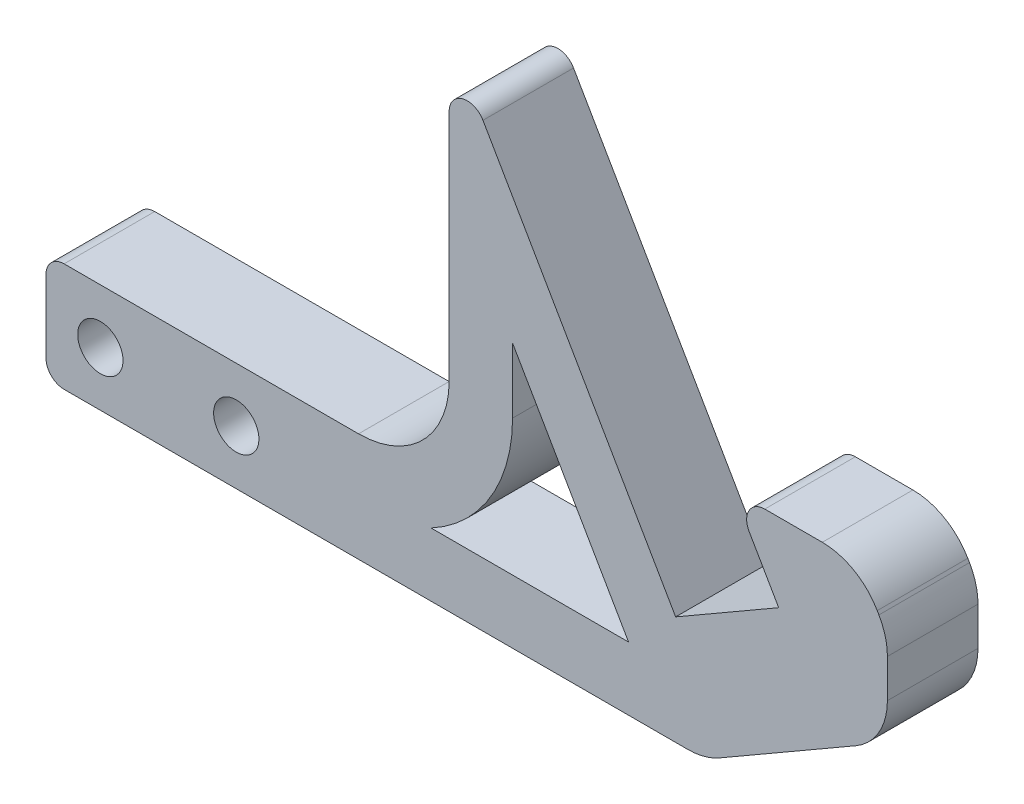
ISO-10303-21;
HEADER;
FILE_DESCRIPTION(('STEP AP214'),'2;1');
FILE_NAME('part.step','',(''),(''),'','','');
FILE_SCHEMA(('AUTOMOTIVE_DESIGN { 1 0 10303 214 1 1 1 1 }'));
ENDSEC;
DATA;
#1=APPLICATION_CONTEXT('core data for automotive mechanical design processes');
#2=APPLICATION_PROTOCOL_DEFINITION('international standard','automotive_design',2000,#1);
#3=PRODUCT_CONTEXT('',#1,'mechanical');
#4=PRODUCT('Part','Part','',(#3));
#5=PRODUCT_RELATED_PRODUCT_CATEGORY('part','',(#4));
#6=PRODUCT_DEFINITION_FORMATION('','',#4);
#7=PRODUCT_DEFINITION_CONTEXT('part definition',#1,'design');
#8=PRODUCT_DEFINITION('design','',#6,#7);
#9=PRODUCT_DEFINITION_SHAPE('','',#8);
#10=(LENGTH_UNIT() NAMED_UNIT(*) SI_UNIT(.MILLI.,.METRE.));
#11=(NAMED_UNIT(*) PLANE_ANGLE_UNIT() SI_UNIT($,.RADIAN.));
#12=(NAMED_UNIT(*) SI_UNIT($,.STERADIAN.) SOLID_ANGLE_UNIT());
#13=UNCERTAINTY_MEASURE_WITH_UNIT(LENGTH_MEASURE(1.E-05),#10,'distance_accuracy_value','');
#14=(GEOMETRIC_REPRESENTATION_CONTEXT(3) GLOBAL_UNCERTAINTY_ASSIGNED_CONTEXT((#13)) GLOBAL_UNIT_ASSIGNED_CONTEXT((#10,
#11,#12)) REPRESENTATION_CONTEXT('',''));
#15=CARTESIAN_POINT('',(0.,0.,0.));
#16=DIRECTION('',(0.,0.,1.));
#17=DIRECTION('',(1.,0.,0.));
#18=AXIS2_PLACEMENT_3D('',#15,#16,#17);
#19=CARTESIAN_POINT('',(32.973417345711,41.8371685740838,10.));
#20=DIRECTION('',(0.,0.,1.));
#21=DIRECTION('',(1.,0.,0.));
#22=AXIS2_PLACEMENT_3D('',#19,#20,#21);
#23=PLANE('',#22);
#24=CARTESIAN_POINT('',(-7.52658265428898,0.,10.));
#25=DIRECTION('',(0.,0.,1.));
#26=DIRECTION('',(1.,0.,0.));
#27=AXIS2_PLACEMENT_3D('',#24,#25,#26);
#28=CIRCLE('',#27,2.5);
#29=CARTESIAN_POINT('',(-5.02658265428898,0.,10.));
#30=VERTEX_POINT('',#29);
#31=EDGE_CURVE('E263',#30,#30,#28,.T.);
#32=ORIENTED_EDGE('',*,*,#31,.F.);
#33=EDGE_LOOP('',(#32));
#34=FACE_BOUND('',#33,.T.);
#35=DIRECTION('',(-0.500000000000004,0.866025403784436,0.));
#36=VECTOR('',#35,1.);
#37=CARTESIAN_POINT('',(55.973417345711,6.,10.));
#38=LINE('',#37,#36);
#39=CARTESIAN_POINT('',(55.973417345711,6.,10.));
#40=VERTEX_POINT('',#39);
#41=CARTESIAN_POINT('',(34.7054681532799,42.8371685740838,10.));
#42=VERTEX_POINT('',#41);
#43=EDGE_CURVE('E271',#40,#42,#38,.T.);
#44=ORIENTED_EDGE('',*,*,#43,.T.);
#45=CARTESIAN_POINT('',(32.973417345711,41.8371685740838,10.));
#46=DIRECTION('',(0.,0.,1.));
#47=DIRECTION('',(1.,0.,0.));
#48=AXIS2_PLACEMENT_3D('',#45,#46,#47);
#49=CIRCLE('',#48,2.);
#50=CARTESIAN_POINT('',(30.973417345711,41.8371685740838,10.));
#51=VERTEX_POINT('',#50);
#52=EDGE_CURVE('E275',#42,#51,#49,.T.);
#53=ORIENTED_EDGE('',*,*,#52,.T.);
#54=DIRECTION('',(0.,-1.,0.));
#55=VECTOR('',#54,1.);
#56=CARTESIAN_POINT('',(30.973417345711,41.8371685740838,10.));
#57=LINE('',#56,#55);
#58=CARTESIAN_POINT('',(30.973417345711,16.0000000000001,10.));
#59=VERTEX_POINT('',#58);
#60=EDGE_CURVE('E279',#51,#59,#57,.T.);
#61=ORIENTED_EDGE('',*,*,#60,.T.);
#62=CARTESIAN_POINT('',(20.973417345711,16.,10.));
#63=DIRECTION('',(0.,0.,-1.));
#64=DIRECTION('',(-1.,0.,0.));
#65=AXIS2_PLACEMENT_3D('',#62,#63,#64);
#66=CIRCLE('',#65,10.);
#67=CARTESIAN_POINT('',(20.9734173457109,6.,10.));
#68=VERTEX_POINT('',#67);
#69=EDGE_CURVE('E282',#59,#68,#66,.T.);
#70=ORIENTED_EDGE('',*,*,#69,.T.);
#71=DIRECTION('',(-1.,0.,0.));
#72=VECTOR('',#71,1.);
#73=CARTESIAN_POINT('',(-11.526582654289,6.,10.));
#74=LINE('',#73,#72);
#75=CARTESIAN_POINT('',(-11.526582654289,6.,10.));
#76=VERTEX_POINT('',#75);
#77=EDGE_CURVE('E285',#68,#76,#74,.T.);
#78=ORIENTED_EDGE('',*,*,#77,.T.);
#79=CARTESIAN_POINT('',(-11.526582654289,4.,10.));
#80=DIRECTION('',(0.,0.,1.));
#81=DIRECTION('',(1.,0.,0.));
#82=AXIS2_PLACEMENT_3D('',#79,#80,#81);
#83=CIRCLE('',#82,2.);
#84=CARTESIAN_POINT('',(-13.526582654289,3.99999999999999,10.));
#85=VERTEX_POINT('',#84);
#86=EDGE_CURVE('E288',#76,#85,#83,.T.);
#87=ORIENTED_EDGE('',*,*,#86,.T.);
#88=DIRECTION('',(0.,-1.,0.));
#89=VECTOR('',#88,1.);
#90=CARTESIAN_POINT('',(-13.526582654289,-3.99999999999999,10.));
#91=LINE('',#90,#89);
#92=CARTESIAN_POINT('',(-13.526582654289,-4.,10.));
#93=VERTEX_POINT('',#92);
#94=EDGE_CURVE('E291',#85,#93,#91,.T.);
#95=ORIENTED_EDGE('',*,*,#94,.T.);
#96=CARTESIAN_POINT('',(-11.526582654289,-4.,10.));
#97=DIRECTION('',(0.,0.,1.));
#98=DIRECTION('',(-1.,0.,0.));
#99=AXIS2_PLACEMENT_3D('',#96,#97,#98);
#100=CIRCLE('',#99,2.);
#101=CARTESIAN_POINT('',(-11.526582654289,-6.,10.));
#102=VERTEX_POINT('',#101);
#103=EDGE_CURVE('E294',#93,#102,#100,.T.);
#104=ORIENTED_EDGE('',*,*,#103,.T.);
#105=DIRECTION('',(1.,0.,0.));
#106=VECTOR('',#105,1.);
#107=CARTESIAN_POINT('',(57.3131633078666,-6.,10.));
#108=LINE('',#107,#106);
#109=CARTESIAN_POINT('',(57.3131633078666,-6.,10.));
#110=VERTEX_POINT('',#109);
#111=EDGE_CURVE('E297',#102,#110,#108,.T.);
#112=ORIENTED_EDGE('',*,*,#111,.T.);
#113=CARTESIAN_POINT('',(57.3131633078667,0.999999999999997,10.));
#114=DIRECTION('',(0.,0.,1.));
#115=DIRECTION('',(-1.,0.,0.));
#116=AXIS2_PLACEMENT_3D('',#113,#114,#115);
#117=CIRCLE('',#116,7.);
#118=CARTESIAN_POINT('',(60.8131633078667,-5.06217782649104,10.));
#119=VERTEX_POINT('',#118);
#120=EDGE_CURVE('E300',#110,#119,#117,.T.);
#121=ORIENTED_EDGE('',*,*,#120,.T.);
#122=DIRECTION('',(0.866025403784434,0.500000000000007,0.));
#123=VECTOR('',#122,1.);
#124=CARTESIAN_POINT('',(75.848943547597,3.61873394239349,10.));
#125=LINE('',#124,#123);
#126=CARTESIAN_POINT('',(75.848943547597,3.61873394239348,10.));
#127=VERTEX_POINT('',#126);
#128=EDGE_CURVE('E303',#119,#127,#125,.T.);
#129=ORIENTED_EDGE('',*,*,#128,.T.);
#130=CARTESIAN_POINT('',(72.3489435475969,9.68091176888453,10.));
#131=DIRECTION('',(0.,0.,1.));
#132=DIRECTION('',(-1.,0.,0.));
#133=AXIS2_PLACEMENT_3D('',#130,#131,#132);
#134=CIRCLE('',#133,7.00000000000002);
#135=CARTESIAN_POINT('',(79.348943547597,9.68091176888453,10.));
#136=VERTEX_POINT('',#135);
#137=EDGE_CURVE('E306',#127,#136,#134,.T.);
#138=ORIENTED_EDGE('',*,*,#137,.T.);
#139=DIRECTION('',(0.,1.,0.));
#140=VECTOR('',#139,1.);
#141=CARTESIAN_POINT('',(79.348943547597,13.9074090769882,10.));
#142=LINE('',#141,#140);
#143=CARTESIAN_POINT('',(79.348943547597,13.9074090769882,10.));
#144=VERTEX_POINT('',#143);
#145=EDGE_CURVE('E309',#136,#144,#142,.T.);
#146=ORIENTED_EDGE('',*,*,#145,.T.);
#147=CARTESIAN_POINT('',(72.3489435475969,13.9074090769882,10.));
#148=DIRECTION('',(0.,0.,1.));
#149=DIRECTION('',(1.,0.,0.));
#150=AXIS2_PLACEMENT_3D('',#147,#148,#149);
#151=CIRCLE('',#150,7.00000000000001);
#152=CARTESIAN_POINT('',(78.411121374088,17.4074090769882,10.));
#153=VERTEX_POINT('',#152);
#154=EDGE_CURVE('E312',#144,#153,#151,.T.);
#155=ORIENTED_EDGE('',*,*,#154,.T.);
#156=DIRECTION('',(-0.499999999999973,0.866025403784454,0.));
#157=VECTOR('',#156,1.);
#158=CARTESIAN_POINT('',(78.2260759503117,17.727917152677,10.));
#159=LINE('',#158,#157);
#160=CARTESIAN_POINT('',(78.2260759503117,17.727917152677,10.));
#161=VERTEX_POINT('',#160);
#162=EDGE_CURVE('E315',#153,#161,#159,.T.);
#163=ORIENTED_EDGE('',*,*,#162,.T.);
#164=CARTESIAN_POINT('',(72.1638981238206,14.227917152677,10.));
#165=DIRECTION('',(0.,0.,1.));
#166=DIRECTION('',(-1.,0.,0.));
#167=AXIS2_PLACEMENT_3D('',#164,#165,#166);
#168=CIRCLE('',#167,7.);
#169=CARTESIAN_POINT('',(72.1638981238206,21.227917152677,10.));
#170=VERTEX_POINT('',#169);
#171=EDGE_CURVE('E318',#161,#170,#168,.T.);
#172=ORIENTED_EDGE('',*,*,#171,.T.);
#173=DIRECTION('',(-1.,0.,0.));
#174=VECTOR('',#173,1.);
#175=CARTESIAN_POINT('',(65.8130451627347,21.227917152677,10.));
#176=LINE('',#175,#174);
#177=CARTESIAN_POINT('',(65.8130451627347,21.227917152677,10.));
#178=VERTEX_POINT('',#177);
#179=EDGE_CURVE('E321',#170,#178,#176,.T.);
#180=ORIENTED_EDGE('',*,*,#179,.T.);
#181=CARTESIAN_POINT('',(65.8130451627347,19.227917152677,10.));
#182=DIRECTION('',(0.,0.,1.));
#183=DIRECTION('',(-1.,0.,0.));
#184=AXIS2_PLACEMENT_3D('',#181,#182,#183);
#185=CIRCLE('',#184,2.);
#186=CARTESIAN_POINT('',(64.0809943551658,18.227917152677,10.));
#187=VERTEX_POINT('',#186);
#188=EDGE_CURVE('E324',#178,#187,#185,.T.);
#189=ORIENTED_EDGE('',*,*,#188,.T.);
#190=DIRECTION('',(0.500000000000004,-0.866025403784436,0.));
#191=VECTOR('',#190,1.);
#192=CARTESIAN_POINT('',(67.348943547597,12.5676631148326,10.));
#193=LINE('',#192,#191);
#194=CARTESIAN_POINT('',(67.348943547597,12.5676631148326,10.));
#195=VERTEX_POINT('',#194);
#196=EDGE_CURVE('E327',#187,#195,#193,.T.);
#197=ORIENTED_EDGE('',*,*,#196,.T.);
#198=DIRECTION('',(-0.866025403784434,-0.500000000000008,0.));
#199=VECTOR('',#198,1.);
#200=CARTESIAN_POINT('',(67.348943547597,12.5676631148326,10.));
#201=LINE('',#200,#199);
#202=EDGE_CURVE('E330',#195,#40,#201,.T.);
#203=ORIENTED_EDGE('',*,*,#202,.T.);
#204=EDGE_LOOP('',(#44,#53,#61,#70,#78,#87,#95,#104,#112,#121,#129,#138,#146,#155,#163,#172,
#180,#189,#197,#203));
#205=FACE_BOUND('',#204,.T.);
#206=CARTESIAN_POINT('',(7.47341734571102,0.,10.));
#207=DIRECTION('',(0.,0.,1.));
#208=DIRECTION('',(1.,0.,0.));
#209=AXIS2_PLACEMENT_3D('',#206,#207,#208);
#210=CIRCLE('',#209,2.5);
#211=CARTESIAN_POINT('',(9.97341734571102,0.,10.));
#212=VERTEX_POINT('',#211);
#213=EDGE_CURVE('E255',#212,#212,#210,.T.);
#214=ORIENTED_EDGE('',*,*,#213,.F.);
#215=EDGE_LOOP('',(#214));
#216=FACE_BOUND('',#215,.T.);
#217=DIRECTION('',(0.,-1.,0.));
#218=VECTOR('',#217,1.);
#219=CARTESIAN_POINT('',(37.973417345711,23.1769145362398,10.));
#220=LINE('',#219,#218);
#221=CARTESIAN_POINT('',(37.973417345711,23.1769145362398,10.));
#222=VERTEX_POINT('',#221);
#223=CARTESIAN_POINT('',(37.973417345711,16.0000000000001,10.));
#224=VERTEX_POINT('',#223);
#225=EDGE_CURVE('E216',#222,#224,#220,.T.);
#226=ORIENTED_EDGE('',*,*,#225,.F.);
#227=DIRECTION('',(-0.5,0.866025403784439,0.));
#228=VECTOR('',#227,1.);
#229=CARTESIAN_POINT('',(50.7772649230044,1.,10.));
#230=LINE('',#229,#228);
#231=CARTESIAN_POINT('',(50.7772649230044,1.,10.));
#232=VERTEX_POINT('',#231);
#233=EDGE_CURVE('E207',#232,#222,#230,.T.);
#234=ORIENTED_EDGE('',*,*,#233,.F.);
#235=DIRECTION('',(1.,0.,0.));
#236=VECTOR('',#235,1.);
#237=CARTESIAN_POINT('',(50.7772649230044,1.,10.));
#238=LINE('',#237,#236);
#239=CARTESIAN_POINT('',(28.973417345711,1.,10.));
#240=VERTEX_POINT('',#239);
#241=EDGE_CURVE('E233',#240,#232,#238,.T.);
#242=ORIENTED_EDGE('',*,*,#241,.F.);
#243=CARTESIAN_POINT('',(20.973417345711,16.,10.));
#244=DIRECTION('',(0.,0.,-1.));
#245=DIRECTION('',(-1.,0.,0.));
#246=AXIS2_PLACEMENT_3D('',#243,#244,#245);
#247=CIRCLE('',#246,17.);
#248=EDGE_CURVE('E229',#224,#240,#247,.T.);
#249=ORIENTED_EDGE('',*,*,#248,.F.);
#250=EDGE_LOOP('',(#226,#234,#242,#249));
#251=FACE_BOUND('',#250,.T.);
#252=ADVANCED_FACE('F45',(#34,#205,#216,#251),#23,.T.);
#253=CARTESIAN_POINT('',(32.973417345711,41.8371685740838,0.));
#254=DIRECTION('',(0.,0.,1.));
#255=DIRECTION('',(1.,0.,0.));
#256=AXIS2_PLACEMENT_3D('',#253,#254,#255);
#257=PLANE('',#256);
#258=CARTESIAN_POINT('',(7.47341734571102,0.,0.));
#259=DIRECTION('',(0.,0.,1.));
#260=DIRECTION('',(1.,0.,0.));
#261=AXIS2_PLACEMENT_3D('',#258,#259,#260);
#262=CIRCLE('',#261,2.5);
#263=CARTESIAN_POINT('',(9.97341734571102,0.,0.));
#264=VERTEX_POINT('',#263);
#265=EDGE_CURVE('E225',#264,#264,#262,.T.);
#266=ORIENTED_EDGE('',*,*,#265,.T.);
#267=EDGE_LOOP('',(#266));
#268=FACE_BOUND('',#267,.T.);
#269=CARTESIAN_POINT('',(-7.52658265428898,0.,0.));
#270=DIRECTION('',(0.,0.,1.));
#271=DIRECTION('',(1.,0.,0.));
#272=AXIS2_PLACEMENT_3D('',#269,#270,#271);
#273=CIRCLE('',#272,2.5);
#274=CARTESIAN_POINT('',(-5.02658265428898,0.,0.));
#275=VERTEX_POINT('',#274);
#276=EDGE_CURVE('E259',#275,#275,#273,.T.);
#277=ORIENTED_EDGE('',*,*,#276,.T.);
#278=EDGE_LOOP('',(#277));
#279=FACE_BOUND('',#278,.T.);
#280=DIRECTION('',(-0.500000000000004,0.866025403784436,0.));
#281=VECTOR('',#280,1.);
#282=CARTESIAN_POINT('',(55.973417345711,6.,0.));
#283=LINE('',#282,#281);
#284=CARTESIAN_POINT('',(55.973417345711,6.,0.));
#285=VERTEX_POINT('',#284);
#286=CARTESIAN_POINT('',(34.7054681532799,42.8371685740838,0.));
#287=VERTEX_POINT('',#286);
#288=EDGE_CURVE('E267',#285,#287,#283,.T.);
#289=ORIENTED_EDGE('',*,*,#288,.F.);
#290=DIRECTION('',(-0.866025403784434,-0.500000000000008,0.));
#291=VECTOR('',#290,1.);
#292=CARTESIAN_POINT('',(67.348943547597,12.5676631148326,0.));
#293=LINE('',#292,#291);
#294=CARTESIAN_POINT('',(67.348943547597,12.5676631148326,0.));
#295=VERTEX_POINT('',#294);
#296=EDGE_CURVE('E276',#295,#285,#293,.T.);
#297=ORIENTED_EDGE('',*,*,#296,.F.);
#298=DIRECTION('',(0.500000000000004,-0.866025403784436,0.));
#299=VECTOR('',#298,1.);
#300=CARTESIAN_POINT('',(67.348943547597,12.5676631148326,0.));
#301=LINE('',#300,#299);
#302=CARTESIAN_POINT('',(64.0809943551658,18.227917152677,0.));
#303=VERTEX_POINT('',#302);
#304=EDGE_CURVE('E388',#303,#295,#301,.T.);
#305=ORIENTED_EDGE('',*,*,#304,.F.);
#306=CARTESIAN_POINT('',(65.8130451627347,19.227917152677,0.));
#307=DIRECTION('',(0.,0.,1.));
#308=DIRECTION('',(-1.,0.,0.));
#309=AXIS2_PLACEMENT_3D('',#306,#307,#308);
#310=CIRCLE('',#309,2.);
#311=CARTESIAN_POINT('',(65.8130451627347,21.227917152677,0.));
#312=VERTEX_POINT('',#311);
#313=EDGE_CURVE('E385',#312,#303,#310,.T.);
#314=ORIENTED_EDGE('',*,*,#313,.F.);
#315=DIRECTION('',(-1.,0.,0.));
#316=VECTOR('',#315,1.);
#317=CARTESIAN_POINT('',(65.8130451627347,21.227917152677,0.));
#318=LINE('',#317,#316);
#319=CARTESIAN_POINT('',(72.1638981238206,21.227917152677,0.));
#320=VERTEX_POINT('',#319);
#321=EDGE_CURVE('E382',#320,#312,#318,.T.);
#322=ORIENTED_EDGE('',*,*,#321,.F.);
#323=CARTESIAN_POINT('',(72.1638981238206,14.227917152677,0.));
#324=DIRECTION('',(0.,0.,1.));
#325=DIRECTION('',(-1.,0.,0.));
#326=AXIS2_PLACEMENT_3D('',#323,#324,#325);
#327=CIRCLE('',#326,7.);
#328=CARTESIAN_POINT('',(78.2260759503117,17.727917152677,0.));
#329=VERTEX_POINT('',#328);
#330=EDGE_CURVE('E379',#329,#320,#327,.T.);
#331=ORIENTED_EDGE('',*,*,#330,.F.);
#332=DIRECTION('',(-0.499999999999973,0.866025403784454,0.));
#333=VECTOR('',#332,1.);
#334=CARTESIAN_POINT('',(78.2260759503117,17.727917152677,0.));
#335=LINE('',#334,#333);
#336=CARTESIAN_POINT('',(78.411121374088,17.4074090769882,0.));
#337=VERTEX_POINT('',#336);
#338=EDGE_CURVE('E376',#337,#329,#335,.T.);
#339=ORIENTED_EDGE('',*,*,#338,.F.);
#340=CARTESIAN_POINT('',(72.3489435475969,13.9074090769882,0.));
#341=DIRECTION('',(0.,0.,1.));
#342=DIRECTION('',(1.,0.,0.));
#343=AXIS2_PLACEMENT_3D('',#340,#341,#342);
#344=CIRCLE('',#343,7.00000000000001);
#345=CARTESIAN_POINT('',(79.348943547597,13.9074090769882,0.));
#346=VERTEX_POINT('',#345);
#347=EDGE_CURVE('E373',#346,#337,#344,.T.);
#348=ORIENTED_EDGE('',*,*,#347,.F.);
#349=DIRECTION('',(0.,1.,0.));
#350=VECTOR('',#349,1.);
#351=CARTESIAN_POINT('',(79.348943547597,13.9074090769882,0.));
#352=LINE('',#351,#350);
#353=CARTESIAN_POINT('',(79.348943547597,9.68091176888453,0.));
#354=VERTEX_POINT('',#353);
#355=EDGE_CURVE('E370',#354,#346,#352,.T.);
#356=ORIENTED_EDGE('',*,*,#355,.F.);
#357=CARTESIAN_POINT('',(72.3489435475969,9.68091176888453,0.));
#358=DIRECTION('',(0.,0.,1.));
#359=DIRECTION('',(-1.,0.,0.));
#360=AXIS2_PLACEMENT_3D('',#357,#358,#359);
#361=CIRCLE('',#360,7.00000000000002);
#362=CARTESIAN_POINT('',(75.848943547597,3.61873394239348,0.));
#363=VERTEX_POINT('',#362);
#364=EDGE_CURVE('E367',#363,#354,#361,.T.);
#365=ORIENTED_EDGE('',*,*,#364,.F.);
#366=DIRECTION('',(0.866025403784434,0.500000000000007,0.));
#367=VECTOR('',#366,1.);
#368=CARTESIAN_POINT('',(75.848943547597,3.61873394239349,0.));
#369=LINE('',#368,#367);
#370=CARTESIAN_POINT('',(60.8131633078667,-5.06217782649104,0.));
#371=VERTEX_POINT('',#370);
#372=EDGE_CURVE('E364',#371,#363,#369,.T.);
#373=ORIENTED_EDGE('',*,*,#372,.F.);
#374=CARTESIAN_POINT('',(57.3131633078667,0.999999999999997,0.));
#375=DIRECTION('',(0.,0.,1.));
#376=DIRECTION('',(-1.,0.,0.));
#377=AXIS2_PLACEMENT_3D('',#374,#375,#376);
#378=CIRCLE('',#377,7.);
#379=CARTESIAN_POINT('',(57.3131633078666,-6.,0.));
#380=VERTEX_POINT('',#379);
#381=EDGE_CURVE('E361',#380,#371,#378,.T.);
#382=ORIENTED_EDGE('',*,*,#381,.F.);
#383=DIRECTION('',(1.,0.,0.));
#384=VECTOR('',#383,1.);
#385=CARTESIAN_POINT('',(57.3131633078666,-6.,0.));
#386=LINE('',#385,#384);
#387=CARTESIAN_POINT('',(-11.526582654289,-6.,0.));
#388=VERTEX_POINT('',#387);
#389=EDGE_CURVE('E358',#388,#380,#386,.T.);
#390=ORIENTED_EDGE('',*,*,#389,.F.);
#391=CARTESIAN_POINT('',(-11.526582654289,-4.,0.));
#392=DIRECTION('',(0.,0.,1.));
#393=DIRECTION('',(-1.,0.,0.));
#394=AXIS2_PLACEMENT_3D('',#391,#392,#393);
#395=CIRCLE('',#394,2.);
#396=CARTESIAN_POINT('',(-13.526582654289,-4.,0.));
#397=VERTEX_POINT('',#396);
#398=EDGE_CURVE('E355',#397,#388,#395,.T.);
#399=ORIENTED_EDGE('',*,*,#398,.F.);
#400=DIRECTION('',(0.,-1.,0.));
#401=VECTOR('',#400,1.);
#402=CARTESIAN_POINT('',(-13.526582654289,-3.99999999999999,0.));
#403=LINE('',#402,#401);
#404=CARTESIAN_POINT('',(-13.526582654289,3.99999999999999,0.));
#405=VERTEX_POINT('',#404);
#406=EDGE_CURVE('E352',#405,#397,#403,.T.);
#407=ORIENTED_EDGE('',*,*,#406,.F.);
#408=CARTESIAN_POINT('',(-11.526582654289,4.,0.));
#409=DIRECTION('',(0.,0.,1.));
#410=DIRECTION('',(1.,0.,0.));
#411=AXIS2_PLACEMENT_3D('',#408,#409,#410);
#412=CIRCLE('',#411,2.);
#413=CARTESIAN_POINT('',(-11.526582654289,6.,0.));
#414=VERTEX_POINT('',#413);
#415=EDGE_CURVE('E349',#414,#405,#412,.T.);
#416=ORIENTED_EDGE('',*,*,#415,.F.);
#417=DIRECTION('',(-1.,0.,0.));
#418=VECTOR('',#417,1.);
#419=CARTESIAN_POINT('',(-11.526582654289,6.,0.));
#420=LINE('',#419,#418);
#421=CARTESIAN_POINT('',(20.9734173457109,6.,0.));
#422=VERTEX_POINT('',#421);
#423=EDGE_CURVE('E346',#422,#414,#420,.T.);
#424=ORIENTED_EDGE('',*,*,#423,.F.);
#425=CARTESIAN_POINT('',(20.973417345711,16.,0.));
#426=DIRECTION('',(0.,0.,-1.));
#427=DIRECTION('',(-1.,0.,0.));
#428=AXIS2_PLACEMENT_3D('',#425,#426,#427);
#429=CIRCLE('',#428,10.);
#430=CARTESIAN_POINT('',(30.973417345711,16.0000000000001,0.));
#431=VERTEX_POINT('',#430);
#432=EDGE_CURVE('E343',#431,#422,#429,.T.);
#433=ORIENTED_EDGE('',*,*,#432,.F.);
#434=DIRECTION('',(0.,-1.,0.));
#435=VECTOR('',#434,1.);
#436=CARTESIAN_POINT('',(30.973417345711,41.8371685740838,0.));
#437=LINE('',#436,#435);
#438=CARTESIAN_POINT('',(30.973417345711,41.8371685740838,0.));
#439=VERTEX_POINT('',#438);
#440=EDGE_CURVE('E340',#439,#431,#437,.T.);
#441=ORIENTED_EDGE('',*,*,#440,.F.);
#442=CARTESIAN_POINT('',(32.973417345711,41.8371685740838,0.));
#443=DIRECTION('',(0.,0.,1.));
#444=DIRECTION('',(1.,0.,0.));
#445=AXIS2_PLACEMENT_3D('',#442,#443,#444);
#446=CIRCLE('',#445,2.);
#447=EDGE_CURVE('E337',#287,#439,#446,.T.);
#448=ORIENTED_EDGE('',*,*,#447,.F.);
#449=EDGE_LOOP('',(#289,#297,#305,#314,#322,#331,#339,#348,#356,#365,#373,#382,#390,#399,#407,
#416,#424,#433,#441,#448));
#450=FACE_BOUND('',#449,.T.);
#451=DIRECTION('',(-0.5,0.866025403784439,0.));
#452=VECTOR('',#451,1.);
#453=CARTESIAN_POINT('',(50.7772649230044,1.,0.));
#454=LINE('',#453,#452);
#455=CARTESIAN_POINT('',(50.7772649230044,1.,0.));
#456=VERTEX_POINT('',#455);
#457=CARTESIAN_POINT('',(37.973417345711,23.1769145362398,0.));
#458=VERTEX_POINT('',#457);
#459=EDGE_CURVE('E69',#456,#458,#454,.T.);
#460=ORIENTED_EDGE('',*,*,#459,.T.);
#461=DIRECTION('',(0.,-1.,0.));
#462=VECTOR('',#461,1.);
#463=CARTESIAN_POINT('',(37.973417345711,23.1769145362398,0.));
#464=LINE('',#463,#462);
#465=CARTESIAN_POINT('',(37.973417345711,16.0000000000001,0.));
#466=VERTEX_POINT('',#465);
#467=EDGE_CURVE('E223',#458,#466,#464,.T.);
#468=ORIENTED_EDGE('',*,*,#467,.T.);
#469=CARTESIAN_POINT('',(20.973417345711,16.,0.));
#470=DIRECTION('',(0.,0.,-1.));
#471=DIRECTION('',(-1.,0.,0.));
#472=AXIS2_PLACEMENT_3D('',#469,#470,#471);
#473=CIRCLE('',#472,17.);
#474=CARTESIAN_POINT('',(28.973417345711,1.,0.));
#475=VERTEX_POINT('',#474);
#476=EDGE_CURVE('E242',#466,#475,#473,.T.);
#477=ORIENTED_EDGE('',*,*,#476,.T.);
#478=DIRECTION('',(1.,0.,0.));
#479=VECTOR('',#478,1.);
#480=CARTESIAN_POINT('',(50.7772649230044,1.,0.));
#481=LINE('',#480,#479);
#482=EDGE_CURVE('E217',#475,#456,#481,.T.);
#483=ORIENTED_EDGE('',*,*,#482,.T.);
#484=EDGE_LOOP('',(#460,#468,#477,#483));
#485=FACE_BOUND('',#484,.T.);
#486=ADVANCED_FACE('F475',(#268,#279,#450,#485),#257,.F.);
#487=CARTESIAN_POINT('',(55.973417345711,6.,10.));
#488=DIRECTION('',(-0.866025403784436,-0.500000000000004,0.));
#489=DIRECTION('',(0.500000000000004,-0.866025403784436,0.));
#490=AXIS2_PLACEMENT_3D('',#487,#488,#489);
#491=PLANE('',#490);
#492=ORIENTED_EDGE('',*,*,#288,.T.);
#493=DIRECTION('',(0.,0.,-1.));
#494=VECTOR('',#493,1.);
#495=CARTESIAN_POINT('',(34.7054681532799,42.8371685740838,10.));
#496=LINE('',#495,#494);
#497=EDGE_CURVE('E11',#42,#287,#496,.T.);
#498=ORIENTED_EDGE('',*,*,#497,.F.);
#499=ORIENTED_EDGE('',*,*,#43,.F.);
#500=DIRECTION('',(0.,0.,-1.));
#501=VECTOR('',#500,1.);
#502=CARTESIAN_POINT('',(55.973417345711,6.,10.));
#503=LINE('',#502,#501);
#504=EDGE_CURVE('E333',#40,#285,#503,.T.);
#505=ORIENTED_EDGE('',*,*,#504,.T.);
#506=EDGE_LOOP('',(#492,#498,#499,#505));
#507=FACE_BOUND('',#506,.T.);
#508=ADVANCED_FACE('F47',(#507),#491,.F.);
#509=CARTESIAN_POINT('',(32.973417345711,41.8371685740838,10.));
#510=DIRECTION('',(0.,0.,-1.));
#511=DIRECTION('',(-1.,0.,0.));
#512=AXIS2_PLACEMENT_3D('',#509,#510,#511);
#513=CYLINDRICAL_SURFACE('',#512,2.);
#514=ORIENTED_EDGE('',*,*,#447,.T.);
#515=DIRECTION('',(0.,0.,-1.));
#516=VECTOR('',#515,1.);
#517=CARTESIAN_POINT('',(30.973417345711,41.8371685740838,10.));
#518=LINE('',#517,#516);
#519=EDGE_CURVE('E54',#51,#439,#518,.T.);
#520=ORIENTED_EDGE('',*,*,#519,.F.);
#521=ORIENTED_EDGE('',*,*,#52,.F.);
#522=ORIENTED_EDGE('',*,*,#497,.T.);
#523=EDGE_LOOP('',(#514,#520,#521,#522));
#524=FACE_BOUND('',#523,.T.);
#525=ADVANCED_FACE('F493',(#524),#513,.T.);
#526=CARTESIAN_POINT('',(30.973417345711,41.8371685740838,10.));
#527=DIRECTION('',(1.,0.,0.));
#528=DIRECTION('',(0.,1.,0.));
#529=AXIS2_PLACEMENT_3D('',#526,#527,#528);
#530=PLANE('',#529);
#531=ORIENTED_EDGE('',*,*,#440,.T.);
#532=DIRECTION('',(0.,0.,-1.));
#533=VECTOR('',#532,1.);
#534=CARTESIAN_POINT('',(30.973417345711,16.0000000000001,10.));
#535=LINE('',#534,#533);
#536=EDGE_CURVE('E460',#59,#431,#535,.T.);
#537=ORIENTED_EDGE('',*,*,#536,.F.);
#538=ORIENTED_EDGE('',*,*,#60,.F.);
#539=ORIENTED_EDGE('',*,*,#519,.T.);
#540=EDGE_LOOP('',(#531,#537,#538,#539));
#541=FACE_BOUND('',#540,.T.);
#542=ADVANCED_FACE('F469',(#541),#530,.F.);
#543=CARTESIAN_POINT('',(20.973417345711,16.,10.));
#544=DIRECTION('',(0.,0.,-1.));
#545=DIRECTION('',(-1.,0.,0.));
#546=AXIS2_PLACEMENT_3D('',#543,#544,#545);
#547=CYLINDRICAL_SURFACE('',#546,10.);
#548=ORIENTED_EDGE('',*,*,#432,.T.);
#549=DIRECTION('',(0.,0.,-1.));
#550=VECTOR('',#549,1.);
#551=CARTESIAN_POINT('',(20.9734173457109,6.,10.));
#552=LINE('',#551,#550);
#553=EDGE_CURVE('E456',#68,#422,#552,.T.);
#554=ORIENTED_EDGE('',*,*,#553,.F.);
#555=ORIENTED_EDGE('',*,*,#69,.F.);
#556=ORIENTED_EDGE('',*,*,#536,.T.);
#557=EDGE_LOOP('',(#548,#554,#555,#556));
#558=FACE_BOUND('',#557,.T.);
#559=ADVANCED_FACE('F481',(#558),#547,.F.);
#560=CARTESIAN_POINT('',(-11.526582654289,6.,10.));
#561=DIRECTION('',(0.,-1.,0.));
#562=DIRECTION('',(1.,0.,0.));
#563=AXIS2_PLACEMENT_3D('',#560,#561,#562);
#564=PLANE('',#563);
#565=ORIENTED_EDGE('',*,*,#423,.T.);
#566=DIRECTION('',(0.,0.,-1.));
#567=VECTOR('',#566,1.);
#568=CARTESIAN_POINT('',(-11.526582654289,6.,10.));
#569=LINE('',#568,#567);
#570=EDGE_CURVE('E452',#76,#414,#569,.T.);
#571=ORIENTED_EDGE('',*,*,#570,.F.);
#572=ORIENTED_EDGE('',*,*,#77,.F.);
#573=ORIENTED_EDGE('',*,*,#553,.T.);
#574=EDGE_LOOP('',(#565,#571,#572,#573));
#575=FACE_BOUND('',#574,.T.);
#576=ADVANCED_FACE('F485',(#575),#564,.F.);
#577=CARTESIAN_POINT('',(-11.526582654289,4.,10.));
#578=DIRECTION('',(0.,0.,-1.));
#579=DIRECTION('',(-1.,0.,0.));
#580=AXIS2_PLACEMENT_3D('',#577,#578,#579);
#581=CYLINDRICAL_SURFACE('',#580,2.);
#582=ORIENTED_EDGE('',*,*,#415,.T.);
#583=DIRECTION('',(0.,0.,-1.));
#584=VECTOR('',#583,1.);
#585=CARTESIAN_POINT('',(-13.526582654289,3.99999999999999,10.));
#586=LINE('',#585,#584);
#587=EDGE_CURVE('E448',#85,#405,#586,.T.);
#588=ORIENTED_EDGE('',*,*,#587,.F.);
#589=ORIENTED_EDGE('',*,*,#86,.F.);
#590=ORIENTED_EDGE('',*,*,#570,.T.);
#591=EDGE_LOOP('',(#582,#588,#589,#590));
#592=FACE_BOUND('',#591,.T.);
#593=ADVANCED_FACE('F566',(#592),#581,.T.);
#594=CARTESIAN_POINT('',(-13.526582654289,-3.99999999999999,10.));
#595=DIRECTION('',(1.,0.,0.));
#596=DIRECTION('',(0.,0.,-1.));
#597=AXIS2_PLACEMENT_3D('',#594,#595,#596);
#598=PLANE('',#597);
#599=ORIENTED_EDGE('',*,*,#406,.T.);
#600=DIRECTION('',(0.,0.,-1.));
#601=VECTOR('',#600,1.);
#602=CARTESIAN_POINT('',(-13.526582654289,-4.,10.));
#603=LINE('',#602,#601);
#604=EDGE_CURVE('E444',#93,#397,#603,.T.);
#605=ORIENTED_EDGE('',*,*,#604,.F.);
#606=ORIENTED_EDGE('',*,*,#94,.F.);
#607=ORIENTED_EDGE('',*,*,#587,.T.);
#608=EDGE_LOOP('',(#599,#605,#606,#607));
#609=FACE_BOUND('',#608,.T.);
#610=ADVANCED_FACE('F564',(#609),#598,.F.);
#611=CARTESIAN_POINT('',(-11.526582654289,-4.,10.));
#612=DIRECTION('',(0.,0.,-1.));
#613=DIRECTION('',(-1.,0.,0.));
#614=AXIS2_PLACEMENT_3D('',#611,#612,#613);
#615=CYLINDRICAL_SURFACE('',#614,2.);
#616=ORIENTED_EDGE('',*,*,#398,.T.);
#617=DIRECTION('',(0.,0.,-1.));
#618=VECTOR('',#617,1.);
#619=CARTESIAN_POINT('',(-11.526582654289,-6.,10.));
#620=LINE('',#619,#618);
#621=EDGE_CURVE('E440',#102,#388,#620,.T.);
#622=ORIENTED_EDGE('',*,*,#621,.F.);
#623=ORIENTED_EDGE('',*,*,#103,.F.);
#624=ORIENTED_EDGE('',*,*,#604,.T.);
#625=EDGE_LOOP('',(#616,#622,#623,#624));
#626=FACE_BOUND('',#625,.T.);
#627=ADVANCED_FACE('F559',(#626),#615,.T.);
#628=CARTESIAN_POINT('',(57.3131633078666,-6.,10.));
#629=DIRECTION('',(0.,1.,0.));
#630=DIRECTION('',(0.,0.,1.));
#631=AXIS2_PLACEMENT_3D('',#628,#629,#630);
#632=PLANE('',#631);
#633=ORIENTED_EDGE('',*,*,#389,.T.);
#634=DIRECTION('',(0.,0.,-1.));
#635=VECTOR('',#634,1.);
#636=CARTESIAN_POINT('',(57.3131633078666,-6.,10.));
#637=LINE('',#636,#635);
#638=EDGE_CURVE('E436',#110,#380,#637,.T.);
#639=ORIENTED_EDGE('',*,*,#638,.F.);
#640=ORIENTED_EDGE('',*,*,#111,.F.);
#641=ORIENTED_EDGE('',*,*,#621,.T.);
#642=EDGE_LOOP('',(#633,#639,#640,#641));
#643=FACE_BOUND('',#642,.T.);
#644=ADVANCED_FACE('F554',(#643),#632,.F.);
#645=CARTESIAN_POINT('',(57.3131633078667,0.999999999999997,10.));
#646=DIRECTION('',(0.,0.,-1.));
#647=DIRECTION('',(-1.,0.,0.));
#648=AXIS2_PLACEMENT_3D('',#645,#646,#647);
#649=CYLINDRICAL_SURFACE('',#648,7.);
#650=ORIENTED_EDGE('',*,*,#381,.T.);
#651=DIRECTION('',(0.,0.,-1.));
#652=VECTOR('',#651,1.);
#653=CARTESIAN_POINT('',(60.8131633078667,-5.06217782649104,10.));
#654=LINE('',#653,#652);
#655=EDGE_CURVE('E432',#119,#371,#654,.T.);
#656=ORIENTED_EDGE('',*,*,#655,.F.);
#657=ORIENTED_EDGE('',*,*,#120,.F.);
#658=ORIENTED_EDGE('',*,*,#638,.T.);
#659=EDGE_LOOP('',(#650,#656,#657,#658));
#660=FACE_BOUND('',#659,.T.);
#661=ADVANCED_FACE('F550',(#660),#649,.T.);
#662=CARTESIAN_POINT('',(75.848943547597,3.61873394239349,10.));
#663=DIRECTION('',(-0.500000000000007,0.866025403784434,0.));
#664=DIRECTION('',(-0.866025403784434,-0.500000000000007,0.));
#665=AXIS2_PLACEMENT_3D('',#662,#663,#664);
#666=PLANE('',#665);
#667=ORIENTED_EDGE('',*,*,#372,.T.);
#668=DIRECTION('',(0.,0.,-1.));
#669=VECTOR('',#668,1.);
#670=CARTESIAN_POINT('',(75.848943547597,3.61873394239348,10.));
#671=LINE('',#670,#669);
#672=EDGE_CURVE('E428',#127,#363,#671,.T.);
#673=ORIENTED_EDGE('',*,*,#672,.F.);
#674=ORIENTED_EDGE('',*,*,#128,.F.);
#675=ORIENTED_EDGE('',*,*,#655,.T.);
#676=EDGE_LOOP('',(#667,#673,#674,#675));
#677=FACE_BOUND('',#676,.T.);
#678=ADVANCED_FACE('F545',(#677),#666,.F.);
#679=CARTESIAN_POINT('',(72.3489435475969,9.68091176888453,10.));
#680=DIRECTION('',(0.,0.,-1.));
#681=DIRECTION('',(-1.,0.,0.));
#682=AXIS2_PLACEMENT_3D('',#679,#680,#681);
#683=CYLINDRICAL_SURFACE('',#682,7.00000000000002);
#684=ORIENTED_EDGE('',*,*,#364,.T.);
#685=DIRECTION('',(0.,0.,-1.));
#686=VECTOR('',#685,1.);
#687=CARTESIAN_POINT('',(79.348943547597,9.68091176888453,10.));
#688=LINE('',#687,#686);
#689=EDGE_CURVE('E424',#136,#354,#688,.T.);
#690=ORIENTED_EDGE('',*,*,#689,.F.);
#691=ORIENTED_EDGE('',*,*,#137,.F.);
#692=ORIENTED_EDGE('',*,*,#672,.T.);
#693=EDGE_LOOP('',(#684,#690,#691,#692));
#694=FACE_BOUND('',#693,.T.);
#695=ADVANCED_FACE('F539',(#694),#683,.T.);
#696=CARTESIAN_POINT('',(79.348943547597,13.9074090769882,10.));
#697=DIRECTION('',(-1.,0.,0.));
#698=DIRECTION('',(0.,0.,1.));
#699=AXIS2_PLACEMENT_3D('',#696,#697,#698);
#700=PLANE('',#699);
#701=ORIENTED_EDGE('',*,*,#355,.T.);
#702=DIRECTION('',(0.,0.,-1.));
#703=VECTOR('',#702,1.);
#704=CARTESIAN_POINT('',(79.348943547597,13.9074090769882,10.));
#705=LINE('',#704,#703);
#706=EDGE_CURVE('E420',#144,#346,#705,.T.);
#707=ORIENTED_EDGE('',*,*,#706,.F.);
#708=ORIENTED_EDGE('',*,*,#145,.F.);
#709=ORIENTED_EDGE('',*,*,#689,.T.);
#710=EDGE_LOOP('',(#701,#707,#708,#709));
#711=FACE_BOUND('',#710,.T.);
#712=ADVANCED_FACE('F535',(#711),#700,.F.);
#713=CARTESIAN_POINT('',(72.3489435475969,13.9074090769882,10.));
#714=DIRECTION('',(0.,0.,-1.));
#715=DIRECTION('',(-1.,0.,0.));
#716=AXIS2_PLACEMENT_3D('',#713,#714,#715);
#717=CYLINDRICAL_SURFACE('',#716,7.00000000000001);
#718=ORIENTED_EDGE('',*,*,#347,.T.);
#719=DIRECTION('',(0.,0.,-1.));
#720=VECTOR('',#719,1.);
#721=CARTESIAN_POINT('',(78.411121374088,17.4074090769882,10.));
#722=LINE('',#721,#720);
#723=EDGE_CURVE('E416',#153,#337,#722,.T.);
#724=ORIENTED_EDGE('',*,*,#723,.F.);
#725=ORIENTED_EDGE('',*,*,#154,.F.);
#726=ORIENTED_EDGE('',*,*,#706,.T.);
#727=EDGE_LOOP('',(#718,#724,#725,#726));
#728=FACE_BOUND('',#727,.T.);
#729=ADVANCED_FACE('F530',(#728),#717,.T.);
#730=CARTESIAN_POINT('',(78.2260759503117,17.727917152677,10.));
#731=DIRECTION('',(-0.866025403784454,-0.499999999999973,0.));
#732=DIRECTION('',(0.499999999999973,-0.866025403784454,0.));
#733=AXIS2_PLACEMENT_3D('',#730,#731,#732);
#734=PLANE('',#733);
#735=ORIENTED_EDGE('',*,*,#338,.T.);
#736=DIRECTION('',(0.,0.,-1.));
#737=VECTOR('',#736,1.);
#738=CARTESIAN_POINT('',(78.2260759503117,17.727917152677,10.));
#739=LINE('',#738,#737);
#740=EDGE_CURVE('E412',#161,#329,#739,.T.);
#741=ORIENTED_EDGE('',*,*,#740,.F.);
#742=ORIENTED_EDGE('',*,*,#162,.F.);
#743=ORIENTED_EDGE('',*,*,#723,.T.);
#744=EDGE_LOOP('',(#735,#741,#742,#743));
#745=FACE_BOUND('',#744,.T.);
#746=ADVANCED_FACE('F524',(#745),#734,.F.);
#747=CARTESIAN_POINT('',(72.1638981238206,14.227917152677,10.));
#748=DIRECTION('',(0.,0.,-1.));
#749=DIRECTION('',(-1.,0.,0.));
#750=AXIS2_PLACEMENT_3D('',#747,#748,#749);
#751=CYLINDRICAL_SURFACE('',#750,7.);
#752=ORIENTED_EDGE('',*,*,#330,.T.);
#753=DIRECTION('',(0.,0.,-1.));
#754=VECTOR('',#753,1.);
#755=CARTESIAN_POINT('',(72.1638981238206,21.227917152677,10.));
#756=LINE('',#755,#754);
#757=EDGE_CURVE('E408',#170,#320,#756,.T.);
#758=ORIENTED_EDGE('',*,*,#757,.F.);
#759=ORIENTED_EDGE('',*,*,#171,.F.);
#760=ORIENTED_EDGE('',*,*,#740,.T.);
#761=EDGE_LOOP('',(#752,#758,#759,#760));
#762=FACE_BOUND('',#761,.T.);
#763=ADVANCED_FACE('F520',(#762),#751,.T.);
#764=CARTESIAN_POINT('',(65.8130451627347,21.227917152677,10.));
#765=DIRECTION('',(0.,-1.,0.));
#766=DIRECTION('',(1.,0.,0.));
#767=AXIS2_PLACEMENT_3D('',#764,#765,#766);
#768=PLANE('',#767);
#769=ORIENTED_EDGE('',*,*,#321,.T.);
#770=DIRECTION('',(0.,0.,-1.));
#771=VECTOR('',#770,1.);
#772=CARTESIAN_POINT('',(65.8130451627347,21.227917152677,10.));
#773=LINE('',#772,#771);
#774=EDGE_CURVE('E404',#178,#312,#773,.T.);
#775=ORIENTED_EDGE('',*,*,#774,.F.);
#776=ORIENTED_EDGE('',*,*,#179,.F.);
#777=ORIENTED_EDGE('',*,*,#757,.T.);
#778=EDGE_LOOP('',(#769,#775,#776,#777));
#779=FACE_BOUND('',#778,.T.);
#780=ADVANCED_FACE('F515',(#779),#768,.F.);
#781=CARTESIAN_POINT('',(65.8130451627347,19.227917152677,10.));
#782=DIRECTION('',(0.,0.,-1.));
#783=DIRECTION('',(-1.,0.,0.));
#784=AXIS2_PLACEMENT_3D('',#781,#782,#783);
#785=CYLINDRICAL_SURFACE('',#784,2.);
#786=ORIENTED_EDGE('',*,*,#313,.T.);
#787=DIRECTION('',(0.,0.,-1.));
#788=VECTOR('',#787,1.);
#789=CARTESIAN_POINT('',(64.0809943551658,18.227917152677,10.));
#790=LINE('',#789,#788);
#791=EDGE_CURVE('E400',#187,#303,#790,.T.);
#792=ORIENTED_EDGE('',*,*,#791,.F.);
#793=ORIENTED_EDGE('',*,*,#188,.F.);
#794=ORIENTED_EDGE('',*,*,#774,.T.);
#795=EDGE_LOOP('',(#786,#792,#793,#794));
#796=FACE_BOUND('',#795,.T.);
#797=ADVANCED_FACE('F509',(#796),#785,.T.);
#798=CARTESIAN_POINT('',(67.348943547597,12.5676631148326,10.));
#799=DIRECTION('',(0.866025403784436,0.500000000000004,0.));
#800=DIRECTION('',(-0.500000000000004,0.866025403784436,0.));
#801=AXIS2_PLACEMENT_3D('',#798,#799,#800);
#802=PLANE('',#801);
#803=ORIENTED_EDGE('',*,*,#304,.T.);
#804=DIRECTION('',(0.,0.,-1.));
#805=VECTOR('',#804,1.);
#806=CARTESIAN_POINT('',(67.348943547597,12.5676631148326,10.));
#807=LINE('',#806,#805);
#808=EDGE_CURVE('E396',#195,#295,#807,.T.);
#809=ORIENTED_EDGE('',*,*,#808,.F.);
#810=ORIENTED_EDGE('',*,*,#196,.F.);
#811=ORIENTED_EDGE('',*,*,#791,.T.);
#812=EDGE_LOOP('',(#803,#809,#810,#811));
#813=FACE_BOUND('',#812,.T.);
#814=ADVANCED_FACE('F505',(#813),#802,.F.);
#815=CARTESIAN_POINT('',(67.348943547597,12.5676631148326,10.));
#816=DIRECTION('',(0.500000000000008,-0.866025403784434,0.));
#817=DIRECTION('',(0.866025403784434,0.500000000000008,0.));
#818=AXIS2_PLACEMENT_3D('',#815,#816,#817);
#819=PLANE('',#818);
#820=ORIENTED_EDGE('',*,*,#296,.T.);
#821=ORIENTED_EDGE('',*,*,#504,.F.);
#822=ORIENTED_EDGE('',*,*,#202,.F.);
#823=ORIENTED_EDGE('',*,*,#808,.T.);
#824=EDGE_LOOP('',(#820,#821,#822,#823));
#825=FACE_BOUND('',#824,.T.);
#826=ADVANCED_FACE('F500',(#825),#819,.F.);
#827=CARTESIAN_POINT('',(-7.52658265428898,0.,10.));
#828=DIRECTION('',(0.,0.,-1.));
#829=DIRECTION('',(-1.,0.,0.));
#830=AXIS2_PLACEMENT_3D('',#827,#828,#829);
#831=CYLINDRICAL_SURFACE('',#830,2.5);
#832=ORIENTED_EDGE('',*,*,#31,.T.);
#833=EDGE_LOOP('',(#832));
#834=FACE_BOUND('',#833,.T.);
#835=ORIENTED_EDGE('',*,*,#276,.F.);
#836=EDGE_LOOP('',(#835));
#837=FACE_BOUND('',#836,.T.);
#838=ADVANCED_FACE('F585',(#834,#837),#831,.F.);
#839=CARTESIAN_POINT('',(7.47341734571102,0.,10.));
#840=DIRECTION('',(0.,0.,-1.));
#841=DIRECTION('',(-1.,0.,0.));
#842=AXIS2_PLACEMENT_3D('',#839,#840,#841);
#843=CYLINDRICAL_SURFACE('',#842,2.5);
#844=ORIENTED_EDGE('',*,*,#213,.T.);
#845=EDGE_LOOP('',(#844));
#846=FACE_BOUND('',#845,.T.);
#847=ORIENTED_EDGE('',*,*,#265,.F.);
#848=EDGE_LOOP('',(#847));
#849=FACE_BOUND('',#848,.T.);
#850=ADVANCED_FACE('F684',(#846,#849),#843,.F.);
#851=CARTESIAN_POINT('',(50.7772649230044,1.,10.));
#852=DIRECTION('',(-0.866025403784439,-0.5,0.));
#853=DIRECTION('',(0.5,-0.866025403784439,0.));
#854=AXIS2_PLACEMENT_3D('',#851,#852,#853);
#855=PLANE('',#854);
#856=ORIENTED_EDGE('',*,*,#459,.F.);
#857=DIRECTION('',(0.,0.,-1.));
#858=VECTOR('',#857,1.);
#859=CARTESIAN_POINT('',(50.7772649230044,1.,10.));
#860=LINE('',#859,#858);
#861=EDGE_CURVE('E211',#232,#456,#860,.T.);
#862=ORIENTED_EDGE('',*,*,#861,.F.);
#863=ORIENTED_EDGE('',*,*,#233,.T.);
#864=DIRECTION('',(0.,0.,-1.));
#865=VECTOR('',#864,1.);
#866=CARTESIAN_POINT('',(37.973417345711,23.1769145362398,10.));
#867=LINE('',#866,#865);
#868=EDGE_CURVE('E210',#222,#458,#867,.T.);
#869=ORIENTED_EDGE('',*,*,#868,.T.);
#870=EDGE_LOOP('',(#856,#862,#863,#869));
#871=FACE_BOUND('',#870,.T.);
#872=ADVANCED_FACE('F209',(#871),#855,.T.);
#873=CARTESIAN_POINT('',(37.973417345711,23.1769145362398,10.));
#874=DIRECTION('',(1.,0.,0.));
#875=DIRECTION('',(0.,1.,0.));
#876=AXIS2_PLACEMENT_3D('',#873,#874,#875);
#877=PLANE('',#876);
#878=ORIENTED_EDGE('',*,*,#467,.F.);
#879=ORIENTED_EDGE('',*,*,#868,.F.);
#880=ORIENTED_EDGE('',*,*,#225,.T.);
#881=DIRECTION('',(0.,0.,-1.));
#882=VECTOR('',#881,1.);
#883=CARTESIAN_POINT('',(37.973417345711,16.0000000000001,10.));
#884=LINE('',#883,#882);
#885=EDGE_CURVE('E226',#224,#466,#884,.T.);
#886=ORIENTED_EDGE('',*,*,#885,.T.);
#887=EDGE_LOOP('',(#878,#879,#880,#886));
#888=FACE_BOUND('',#887,.T.);
#889=ADVANCED_FACE('F220',(#888),#877,.T.);
#890=CARTESIAN_POINT('',(20.973417345711,16.,10.));
#891=DIRECTION('',(0.,0.,-1.));
#892=DIRECTION('',(-1.,0.,0.));
#893=AXIS2_PLACEMENT_3D('',#890,#891,#892);
#894=CYLINDRICAL_SURFACE('',#893,17.);
#895=ORIENTED_EDGE('',*,*,#476,.F.);
#896=ORIENTED_EDGE('',*,*,#885,.F.);
#897=ORIENTED_EDGE('',*,*,#248,.T.);
#898=DIRECTION('',(0.,0.,-1.));
#899=VECTOR('',#898,1.);
#900=CARTESIAN_POINT('',(28.973417345711,1.,10.));
#901=LINE('',#900,#899);
#902=EDGE_CURVE('E61',#240,#475,#901,.T.);
#903=ORIENTED_EDGE('',*,*,#902,.T.);
#904=EDGE_LOOP('',(#895,#896,#897,#903));
#905=FACE_BOUND('',#904,.T.);
#906=ADVANCED_FACE('F706',(#905),#894,.T.);
#907=CARTESIAN_POINT('',(50.7772649230044,1.,10.));
#908=DIRECTION('',(0.,1.,0.));
#909=DIRECTION('',(-1.,0.,0.));
#910=AXIS2_PLACEMENT_3D('',#907,#908,#909);
#911=PLANE('',#910);
#912=ORIENTED_EDGE('',*,*,#482,.F.);
#913=ORIENTED_EDGE('',*,*,#902,.F.);
#914=ORIENTED_EDGE('',*,*,#241,.T.);
#915=ORIENTED_EDGE('',*,*,#861,.T.);
#916=EDGE_LOOP('',(#912,#913,#914,#915));
#917=FACE_BOUND('',#916,.T.);
#918=ADVANCED_FACE('F714',(#917),#911,.T.);
#919=CLOSED_SHELL('',(#252,#486,#508,#525,#542,#559,#576,#593,#610,#627,#644,#661,#678,#695,
#712,#729,#746,#763,#780,#797,#814,#826,#838,#850,#872,#889,#906,#918));
#920=MANIFOLD_SOLID_BREP('B2',#919);
#921=ADVANCED_BREP_SHAPE_REPRESENTATION('',(#18,#920),#14);
#922=SHAPE_DEFINITION_REPRESENTATION(#9,#921);
ENDSEC;
END-ISO-10303-21;
